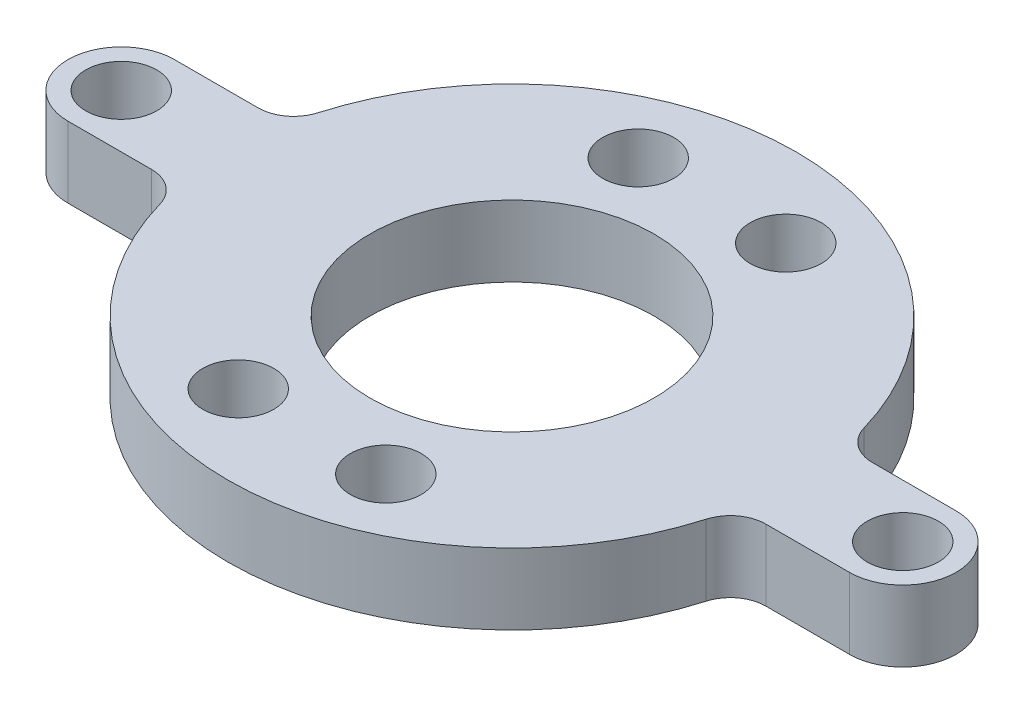
ISO-10303-21;
HEADER;
FILE_DESCRIPTION(('STEP AP214'),'2;1');
FILE_NAME('part.step','',(''),(''),'','','');
FILE_SCHEMA(('AUTOMOTIVE_DESIGN { 1 0 10303 214 1 1 1 1 }'));
ENDSEC;
DATA;
#1=APPLICATION_CONTEXT('core data for automotive mechanical design processes');
#2=APPLICATION_PROTOCOL_DEFINITION('international standard','automotive_design',2000,#1);
#3=PRODUCT_CONTEXT('',#1,'mechanical');
#4=PRODUCT('Part','Part','',(#3));
#5=PRODUCT_RELATED_PRODUCT_CATEGORY('part','',(#4));
#6=PRODUCT_DEFINITION_FORMATION('','',#4);
#7=PRODUCT_DEFINITION_CONTEXT('part definition',#1,'design');
#8=PRODUCT_DEFINITION('design','',#6,#7);
#9=PRODUCT_DEFINITION_SHAPE('','',#8);
#10=(LENGTH_UNIT() NAMED_UNIT(*) SI_UNIT(.MILLI.,.METRE.));
#11=(NAMED_UNIT(*) PLANE_ANGLE_UNIT() SI_UNIT($,.RADIAN.));
#12=(NAMED_UNIT(*) SI_UNIT($,.STERADIAN.) SOLID_ANGLE_UNIT());
#13=UNCERTAINTY_MEASURE_WITH_UNIT(LENGTH_MEASURE(1.E-05),#10,'distance_accuracy_value','');
#14=(GEOMETRIC_REPRESENTATION_CONTEXT(3) GLOBAL_UNCERTAINTY_ASSIGNED_CONTEXT((#13)) GLOBAL_UNIT_ASSIGNED_CONTEXT((#10,
#11,#12)) REPRESENTATION_CONTEXT('',''));
#15=CARTESIAN_POINT('',(0.,0.,0.));
#16=DIRECTION('',(0.,0.,1.));
#17=DIRECTION('',(1.,0.,0.));
#18=AXIS2_PLACEMENT_3D('',#15,#16,#17);
#19=CARTESIAN_POINT('',(43.2290411644765,10.,12.4999999999997));
#20=DIRECTION('',(0.,-1.,0.));
#21=DIRECTION('',(0.,0.,-1.));
#22=AXIS2_PLACEMENT_3D('',#19,#20,#21);
#23=PLANE('',#22);
#24=CARTESIAN_POINT('',(43.2290411644765,10.,12.4999999999997));
#25=DIRECTION('',(0.,-1.,0.));
#26=DIRECTION('',(0.,0.,-1.));
#27=AXIS2_PLACEMENT_3D('',#24,#25,#26);
#28=CIRCLE('',#27,4.99999999999998);
#29=CARTESIAN_POINT('',(38.4258143684236,10.,11.1111111111109));
#30=VERTEX_POINT('',#29);
#31=CARTESIAN_POINT('',(43.2290411644765,10.,7.49999999999967));
#32=VERTEX_POINT('',#31);
#33=EDGE_CURVE('E200',#30,#32,#28,.T.);
#34=ORIENTED_EDGE('',*,*,#33,.T.);
#35=DIRECTION('',(1.,0.,0.));
#36=VECTOR('',#35,1.);
#37=CARTESIAN_POINT('',(55.0000000000001,10.,7.49999999999967));
#38=LINE('',#37,#36);
#39=CARTESIAN_POINT('',(55.0000000000001,10.,7.5));
#40=VERTEX_POINT('',#39);
#41=EDGE_CURVE('E112',#32,#40,#38,.T.);
#42=ORIENTED_EDGE('',*,*,#41,.T.);
#43=CARTESIAN_POINT('',(55.,10.,0.));
#44=DIRECTION('',(0.,1.,0.));
#45=DIRECTION('',(0.,0.,1.));
#46=AXIS2_PLACEMENT_3D('',#43,#44,#45);
#47=CIRCLE('',#46,7.5);
#48=CARTESIAN_POINT('',(54.9999999999999,10.,-7.50000000000033));
#49=VERTEX_POINT('',#48);
#50=EDGE_CURVE('E237',#40,#49,#47,.T.);
#51=ORIENTED_EDGE('',*,*,#50,.T.);
#52=DIRECTION('',(-1.,0.,0.));
#53=VECTOR('',#52,1.);
#54=CARTESIAN_POINT('',(54.9999999999999,10.,-7.50000000000033));
#55=LINE('',#54,#53);
#56=CARTESIAN_POINT('',(43.2290411644764,10.,-7.50000000000032));
#57=VERTEX_POINT('',#56);
#58=EDGE_CURVE('E257',#49,#57,#55,.T.);
#59=ORIENTED_EDGE('',*,*,#58,.T.);
#60=CARTESIAN_POINT('',(43.2290411644764,10.,-12.5000000000003));
#61=DIRECTION('',(0.,-1.,0.));
#62=DIRECTION('',(0.,0.,1.));
#63=AXIS2_PLACEMENT_3D('',#60,#61,#62);
#64=CIRCLE('',#63,5.00000000000001);
#65=CARTESIAN_POINT('',(38.4258143684234,10.,-11.1111111111113));
#66=VERTEX_POINT('',#65);
#67=EDGE_CURVE('E253',#57,#66,#64,.T.);
#68=ORIENTED_EDGE('',*,*,#67,.T.);
#69=CARTESIAN_POINT('',(0.,10.,0.));
#70=DIRECTION('',(0.,1.,0.));
#71=DIRECTION('',(0.,0.,1.));
#72=AXIS2_PLACEMENT_3D('',#69,#70,#71);
#73=CIRCLE('',#72,40.);
#74=CARTESIAN_POINT('',(-38.4258143684235,10.,-11.1111111111111));
#75=VERTEX_POINT('',#74);
#76=EDGE_CURVE('E256',#66,#75,#73,.T.);
#77=ORIENTED_EDGE('',*,*,#76,.T.);
#78=CARTESIAN_POINT('',(-43.2290411644765,10.,-12.5));
#79=DIRECTION('',(0.,-1.,0.));
#80=DIRECTION('',(0.,0.,-1.));
#81=AXIS2_PLACEMENT_3D('',#78,#79,#80);
#82=CIRCLE('',#81,5.);
#83=CARTESIAN_POINT('',(-43.2290411644765,10.,-7.5));
#84=VERTEX_POINT('',#83);
#85=EDGE_CURVE('E261',#75,#84,#82,.T.);
#86=ORIENTED_EDGE('',*,*,#85,.T.);
#87=DIRECTION('',(-1.,0.,0.));
#88=VECTOR('',#87,1.);
#89=CARTESIAN_POINT('',(-55.,10.,-7.5));
#90=LINE('',#89,#88);
#91=CARTESIAN_POINT('',(-55.,10.,-7.49999999999967));
#92=VERTEX_POINT('',#91);
#93=EDGE_CURVE('E268',#84,#92,#90,.T.);
#94=ORIENTED_EDGE('',*,*,#93,.T.);
#95=CARTESIAN_POINT('',(-55.,10.,3.33066907387547E-13));
#96=DIRECTION('',(0.,1.,0.));
#97=DIRECTION('',(0.,0.,-1.));
#98=AXIS2_PLACEMENT_3D('',#95,#96,#97);
#99=CIRCLE('',#98,7.5);
#100=CARTESIAN_POINT('',(-55.,10.,7.5));
#101=VERTEX_POINT('',#100);
#102=EDGE_CURVE('E143',#92,#101,#99,.T.);
#103=ORIENTED_EDGE('',*,*,#102,.T.);
#104=DIRECTION('',(1.,0.,0.));
#105=VECTOR('',#104,1.);
#106=CARTESIAN_POINT('',(-55.,10.,7.5));
#107=LINE('',#106,#105);
#108=CARTESIAN_POINT('',(-43.2290411644765,10.,7.5));
#109=VERTEX_POINT('',#108);
#110=EDGE_CURVE('E137',#101,#109,#107,.T.);
#111=ORIENTED_EDGE('',*,*,#110,.T.);
#112=CARTESIAN_POINT('',(-43.2290411644765,10.,12.5));
#113=DIRECTION('',(0.,-1.,0.));
#114=DIRECTION('',(0.,0.,1.));
#115=AXIS2_PLACEMENT_3D('',#112,#113,#114);
#116=CIRCLE('',#115,5.);
#117=CARTESIAN_POINT('',(-38.4258143684235,10.,11.1111111111111));
#118=VERTEX_POINT('',#117);
#119=EDGE_CURVE('E141',#109,#118,#116,.T.);
#120=ORIENTED_EDGE('',*,*,#119,.T.);
#121=CARTESIAN_POINT('',(0.,10.,0.));
#122=DIRECTION('',(0.,1.,0.));
#123=DIRECTION('',(0.,0.,1.));
#124=AXIS2_PLACEMENT_3D('',#121,#122,#123);
#125=CIRCLE('',#124,40.);
#126=EDGE_CURVE('E57',#118,#30,#125,.T.);
#127=ORIENTED_EDGE('',*,*,#126,.T.);
#128=EDGE_LOOP('',(#34,#42,#51,#59,#68,#77,#86,#94,#103,#111,#120,#127));
#129=FACE_BOUND('',#128,.T.);
#130=CARTESIAN_POINT('',(0.,10.,0.));
#131=DIRECTION('',(0.,1.,0.));
#132=DIRECTION('',(0.,0.,1.));
#133=AXIS2_PLACEMENT_3D('',#130,#131,#132);
#134=CIRCLE('',#133,20.);
#135=CARTESIAN_POINT('',(0.,10.,20.));
#136=VERTEX_POINT('',#135);
#137=EDGE_CURVE('E170',#136,#136,#134,.T.);
#138=ORIENTED_EDGE('',*,*,#137,.F.);
#139=EDGE_LOOP('',(#138));
#140=FACE_BOUND('',#139,.T.);
#141=CARTESIAN_POINT('',(55.,10.,0.));
#142=DIRECTION('',(0.,1.,0.));
#143=DIRECTION('',(0.,0.,1.));
#144=AXIS2_PLACEMENT_3D('',#141,#142,#143);
#145=CIRCLE('',#144,5.);
#146=CARTESIAN_POINT('',(55.,10.,5.));
#147=VERTEX_POINT('',#146);
#148=EDGE_CURVE('E374',#147,#147,#145,.T.);
#149=ORIENTED_EDGE('',*,*,#148,.F.);
#150=EDGE_LOOP('',(#149));
#151=FACE_BOUND('',#150,.T.);
#152=CARTESIAN_POINT('',(-55.,10.,3.33066907387547E-13));
#153=DIRECTION('',(0.,1.,0.));
#154=DIRECTION('',(0.,0.,-1.));
#155=AXIS2_PLACEMENT_3D('',#152,#153,#154);
#156=CIRCLE('',#155,4.99999999999999);
#157=CARTESIAN_POINT('',(-55.,10.,-4.99999999999965));
#158=VERTEX_POINT('',#157);
#159=EDGE_CURVE('E366',#158,#158,#156,.T.);
#160=ORIENTED_EDGE('',*,*,#159,.F.);
#161=EDGE_LOOP('',(#160));
#162=FACE_BOUND('',#161,.T.);
#163=CARTESIAN_POINT('',(10.3835117123248,10.,-28.1457400776745));
#164=DIRECTION('',(0.,1.,0.));
#165=DIRECTION('',(0.,0.,1.));
#166=AXIS2_PLACEMENT_3D('',#163,#164,#165);
#167=CIRCLE('',#166,5.);
#168=CARTESIAN_POINT('',(10.3835117123248,10.,-23.1457400776745));
#169=VERTEX_POINT('',#168);
#170=EDGE_CURVE('E358',#169,#169,#167,.T.);
#171=ORIENTED_EDGE('',*,*,#170,.F.);
#172=EDGE_LOOP('',(#171));
#173=FACE_BOUND('',#172,.T.);
#174=CARTESIAN_POINT('',(-10.3835117123248,10.,-28.1457400776745));
#175=DIRECTION('',(0.,1.,0.));
#176=DIRECTION('',(0.,0.,-1.));
#177=AXIS2_PLACEMENT_3D('',#174,#175,#176);
#178=CIRCLE('',#177,5.);
#179=CARTESIAN_POINT('',(-10.3835117123248,10.,-33.1457400776745));
#180=VERTEX_POINT('',#179);
#181=EDGE_CURVE('E350',#180,#180,#178,.T.);
#182=ORIENTED_EDGE('',*,*,#181,.F.);
#183=EDGE_LOOP('',(#182));
#184=FACE_BOUND('',#183,.T.);
#185=CARTESIAN_POINT('',(10.383511712325,10.,28.1457400776744));
#186=DIRECTION('',(0.,1.,0.));
#187=DIRECTION('',(0.,0.,-1.));
#188=AXIS2_PLACEMENT_3D('',#185,#186,#187);
#189=CIRCLE('',#188,4.99999999999984);
#190=CARTESIAN_POINT('',(10.383511712325,10.,23.1457400776746));
#191=VERTEX_POINT('',#190);
#192=EDGE_CURVE('E342',#191,#191,#189,.T.);
#193=ORIENTED_EDGE('',*,*,#192,.F.);
#194=EDGE_LOOP('',(#193));
#195=FACE_BOUND('',#194,.T.);
#196=CARTESIAN_POINT('',(-10.3835117123248,10.,28.1457400776745));
#197=DIRECTION('',(0.,1.,0.));
#198=DIRECTION('',(0.,0.,1.));
#199=AXIS2_PLACEMENT_3D('',#196,#197,#198);
#200=CIRCLE('',#199,5.);
#201=CARTESIAN_POINT('',(-10.3835117123248,10.,33.1457400776745));
#202=VERTEX_POINT('',#201);
#203=EDGE_CURVE('E331',#202,#202,#200,.T.);
#204=ORIENTED_EDGE('',*,*,#203,.F.);
#205=EDGE_LOOP('',(#204));
#206=FACE_BOUND('',#205,.T.);
#207=ADVANCED_FACE('F39',(#129,#140,#151,#162,#173,#184,#195,#206),#23,.F.);
#208=CARTESIAN_POINT('',(43.2290411644765,0.,12.4999999999997));
#209=DIRECTION('',(0.,-1.,0.));
#210=DIRECTION('',(0.,0.,-1.));
#211=AXIS2_PLACEMENT_3D('',#208,#209,#210);
#212=PLANE('',#211);
#213=CARTESIAN_POINT('',(10.383511712325,0.,28.1457400776744));
#214=DIRECTION('',(0.,1.,0.));
#215=DIRECTION('',(0.,0.,-1.));
#216=AXIS2_PLACEMENT_3D('',#213,#214,#215);
#217=CIRCLE('',#216,4.99999999999984);
#218=CARTESIAN_POINT('',(10.383511712325,0.,23.1457400776746));
#219=VERTEX_POINT('',#218);
#220=EDGE_CURVE('E339',#219,#219,#217,.T.);
#221=ORIENTED_EDGE('',*,*,#220,.T.);
#222=EDGE_LOOP('',(#221));
#223=FACE_BOUND('',#222,.T.);
#224=CARTESIAN_POINT('',(10.3835117123248,0.,-28.1457400776745));
#225=DIRECTION('',(0.,1.,0.));
#226=DIRECTION('',(0.,0.,1.));
#227=AXIS2_PLACEMENT_3D('',#224,#225,#226);
#228=CIRCLE('',#227,5.);
#229=CARTESIAN_POINT('',(10.3835117123248,0.,-23.1457400776745));
#230=VERTEX_POINT('',#229);
#231=EDGE_CURVE('E354',#230,#230,#228,.T.);
#232=ORIENTED_EDGE('',*,*,#231,.T.);
#233=EDGE_LOOP('',(#232));
#234=FACE_BOUND('',#233,.T.);
#235=CARTESIAN_POINT('',(55.,0.,0.));
#236=DIRECTION('',(0.,1.,0.));
#237=DIRECTION('',(0.,0.,1.));
#238=AXIS2_PLACEMENT_3D('',#235,#236,#237);
#239=CIRCLE('',#238,5.);
#240=CARTESIAN_POINT('',(55.,0.,5.));
#241=VERTEX_POINT('',#240);
#242=EDGE_CURVE('E370',#241,#241,#239,.T.);
#243=ORIENTED_EDGE('',*,*,#242,.T.);
#244=EDGE_LOOP('',(#243));
#245=FACE_BOUND('',#244,.T.);
#246=CARTESIAN_POINT('',(43.2290411644765,0.,12.4999999999997));
#247=DIRECTION('',(0.,-1.,0.));
#248=DIRECTION('',(0.,0.,-1.));
#249=AXIS2_PLACEMENT_3D('',#246,#247,#248);
#250=CIRCLE('',#249,4.99999999999998);
#251=CARTESIAN_POINT('',(38.4258143684236,0.,11.1111111111109));
#252=VERTEX_POINT('',#251);
#253=CARTESIAN_POINT('',(43.2290411644765,0.,7.49999999999967));
#254=VERTEX_POINT('',#253);
#255=EDGE_CURVE('E165',#252,#254,#250,.T.);
#256=ORIENTED_EDGE('',*,*,#255,.F.);
#257=CARTESIAN_POINT('',(0.,0.,0.));
#258=DIRECTION('',(0.,1.,0.));
#259=DIRECTION('',(0.,0.,1.));
#260=AXIS2_PLACEMENT_3D('',#257,#258,#259);
#261=CIRCLE('',#260,40.);
#262=CARTESIAN_POINT('',(-38.4258143684235,0.,11.1111111111111));
#263=VERTEX_POINT('',#262);
#264=EDGE_CURVE('E104',#263,#252,#261,.T.);
#265=ORIENTED_EDGE('',*,*,#264,.F.);
#266=CARTESIAN_POINT('',(-43.2290411644765,0.,12.5));
#267=DIRECTION('',(0.,-1.,0.));
#268=DIRECTION('',(0.,0.,1.));
#269=AXIS2_PLACEMENT_3D('',#266,#267,#268);
#270=CIRCLE('',#269,5.);
#271=CARTESIAN_POINT('',(-43.2290411644765,0.,7.5));
#272=VERTEX_POINT('',#271);
#273=EDGE_CURVE('E98',#272,#263,#270,.T.);
#274=ORIENTED_EDGE('',*,*,#273,.F.);
#275=DIRECTION('',(1.,0.,0.));
#276=VECTOR('',#275,1.);
#277=CARTESIAN_POINT('',(-55.,0.,7.5));
#278=LINE('',#277,#276);
#279=CARTESIAN_POINT('',(-55.,0.,7.5));
#280=VERTEX_POINT('',#279);
#281=EDGE_CURVE('E152',#280,#272,#278,.T.);
#282=ORIENTED_EDGE('',*,*,#281,.F.);
#283=CARTESIAN_POINT('',(-55.,0.,3.33066907387547E-13));
#284=DIRECTION('',(0.,1.,0.));
#285=DIRECTION('',(0.,0.,-1.));
#286=AXIS2_PLACEMENT_3D('',#283,#284,#285);
#287=CIRCLE('',#286,7.5);
#288=CARTESIAN_POINT('',(-55.,0.,-7.49999999999967));
#289=VERTEX_POINT('',#288);
#290=EDGE_CURVE('E191',#289,#280,#287,.T.);
#291=ORIENTED_EDGE('',*,*,#290,.F.);
#292=DIRECTION('',(-1.,0.,0.));
#293=VECTOR('',#292,1.);
#294=CARTESIAN_POINT('',(-55.,0.,-7.5));
#295=LINE('',#294,#293);
#296=CARTESIAN_POINT('',(-43.2290411644765,0.,-7.5));
#297=VERTEX_POINT('',#296);
#298=EDGE_CURVE('E188',#297,#289,#295,.T.);
#299=ORIENTED_EDGE('',*,*,#298,.F.);
#300=CARTESIAN_POINT('',(-43.2290411644765,0.,-12.5));
#301=DIRECTION('',(0.,-1.,0.));
#302=DIRECTION('',(0.,0.,-1.));
#303=AXIS2_PLACEMENT_3D('',#300,#301,#302);
#304=CIRCLE('',#303,5.);
#305=CARTESIAN_POINT('',(-38.4258143684235,0.,-11.1111111111111));
#306=VERTEX_POINT('',#305);
#307=EDGE_CURVE('E185',#306,#297,#304,.T.);
#308=ORIENTED_EDGE('',*,*,#307,.F.);
#309=CARTESIAN_POINT('',(0.,0.,0.));
#310=DIRECTION('',(0.,1.,0.));
#311=DIRECTION('',(0.,0.,1.));
#312=AXIS2_PLACEMENT_3D('',#309,#310,#311);
#313=CIRCLE('',#312,40.);
#314=CARTESIAN_POINT('',(38.4258143684234,0.,-11.1111111111113));
#315=VERTEX_POINT('',#314);
#316=EDGE_CURVE('E182',#315,#306,#313,.T.);
#317=ORIENTED_EDGE('',*,*,#316,.F.);
#318=CARTESIAN_POINT('',(43.2290411644764,0.,-12.5000000000003));
#319=DIRECTION('',(0.,-1.,0.));
#320=DIRECTION('',(0.,0.,1.));
#321=AXIS2_PLACEMENT_3D('',#318,#319,#320);
#322=CIRCLE('',#321,5.00000000000001);
#323=CARTESIAN_POINT('',(43.2290411644764,0.,-7.50000000000032));
#324=VERTEX_POINT('',#323);
#325=EDGE_CURVE('E179',#324,#315,#322,.T.);
#326=ORIENTED_EDGE('',*,*,#325,.F.);
#327=DIRECTION('',(-1.,0.,0.));
#328=VECTOR('',#327,1.);
#329=CARTESIAN_POINT('',(54.9999999999999,0.,-7.50000000000033));
#330=LINE('',#329,#328);
#331=CARTESIAN_POINT('',(54.9999999999999,0.,-7.50000000000033));
#332=VERTEX_POINT('',#331);
#333=EDGE_CURVE('E176',#332,#324,#330,.T.);
#334=ORIENTED_EDGE('',*,*,#333,.F.);
#335=CARTESIAN_POINT('',(55.,0.,0.));
#336=DIRECTION('',(0.,1.,0.));
#337=DIRECTION('',(0.,0.,1.));
#338=AXIS2_PLACEMENT_3D('',#335,#336,#337);
#339=CIRCLE('',#338,7.5);
#340=CARTESIAN_POINT('',(55.0000000000001,0.,7.5));
#341=VERTEX_POINT('',#340);
#342=EDGE_CURVE('E173',#341,#332,#339,.T.);
#343=ORIENTED_EDGE('',*,*,#342,.F.);
#344=DIRECTION('',(1.,0.,0.));
#345=VECTOR('',#344,1.);
#346=CARTESIAN_POINT('',(55.0000000000001,0.,7.49999999999967));
#347=LINE('',#346,#345);
#348=EDGE_CURVE('E169',#254,#341,#347,.T.);
#349=ORIENTED_EDGE('',*,*,#348,.F.);
#350=EDGE_LOOP('',(#256,#265,#274,#282,#291,#299,#308,#317,#326,#334,#343,#349));
#351=FACE_BOUND('',#350,.T.);
#352=CARTESIAN_POINT('',(0.,0.,0.));
#353=DIRECTION('',(0.,1.,0.));
#354=DIRECTION('',(0.,0.,1.));
#355=AXIS2_PLACEMENT_3D('',#352,#353,#354);
#356=CIRCLE('',#355,20.);
#357=CARTESIAN_POINT('',(0.,0.,20.));
#358=VERTEX_POINT('',#357);
#359=EDGE_CURVE('E378',#358,#358,#356,.T.);
#360=ORIENTED_EDGE('',*,*,#359,.T.);
#361=EDGE_LOOP('',(#360));
#362=FACE_BOUND('',#361,.T.);
#363=CARTESIAN_POINT('',(-55.,0.,3.33066907387547E-13));
#364=DIRECTION('',(0.,1.,0.));
#365=DIRECTION('',(0.,0.,-1.));
#366=AXIS2_PLACEMENT_3D('',#363,#364,#365);
#367=CIRCLE('',#366,4.99999999999999);
#368=CARTESIAN_POINT('',(-55.,0.,-4.99999999999965));
#369=VERTEX_POINT('',#368);
#370=EDGE_CURVE('E362',#369,#369,#367,.T.);
#371=ORIENTED_EDGE('',*,*,#370,.T.);
#372=EDGE_LOOP('',(#371));
#373=FACE_BOUND('',#372,.T.);
#374=CARTESIAN_POINT('',(-10.3835117123248,0.,-28.1457400776745));
#375=DIRECTION('',(0.,1.,0.));
#376=DIRECTION('',(0.,0.,-1.));
#377=AXIS2_PLACEMENT_3D('',#374,#375,#376);
#378=CIRCLE('',#377,5.);
#379=CARTESIAN_POINT('',(-10.3835117123248,0.,-33.1457400776745));
#380=VERTEX_POINT('',#379);
#381=EDGE_CURVE('E346',#380,#380,#378,.T.);
#382=ORIENTED_EDGE('',*,*,#381,.T.);
#383=EDGE_LOOP('',(#382));
#384=FACE_BOUND('',#383,.T.);
#385=CARTESIAN_POINT('',(-10.3835117123248,0.,28.1457400776745));
#386=DIRECTION('',(0.,1.,0.));
#387=DIRECTION('',(0.,0.,1.));
#388=AXIS2_PLACEMENT_3D('',#385,#386,#387);
#389=CIRCLE('',#388,5.);
#390=CARTESIAN_POINT('',(-10.3835117123248,0.,33.1457400776745));
#391=VERTEX_POINT('',#390);
#392=EDGE_CURVE('E334',#391,#391,#389,.T.);
#393=ORIENTED_EDGE('',*,*,#392,.T.);
#394=EDGE_LOOP('',(#393));
#395=FACE_BOUND('',#394,.T.);
#396=ADVANCED_FACE('F241',(#223,#234,#245,#351,#362,#373,#384,#395),#212,.T.);
#397=CARTESIAN_POINT('',(43.2290411644765,10.,12.4999999999997));
#398=DIRECTION('',(0.,-1.,0.));
#399=DIRECTION('',(0.,0.,-1.));
#400=AXIS2_PLACEMENT_3D('',#397,#398,#399);
#401=CYLINDRICAL_SURFACE('',#400,4.99999999999998);
#402=ORIENTED_EDGE('',*,*,#255,.T.);
#403=DIRECTION('',(0.,-1.,0.));
#404=VECTOR('',#403,1.);
#405=CARTESIAN_POINT('',(43.2290411644765,10.,7.49999999999967));
#406=LINE('',#405,#404);
#407=EDGE_CURVE('E11',#32,#254,#406,.T.);
#408=ORIENTED_EDGE('',*,*,#407,.F.);
#409=ORIENTED_EDGE('',*,*,#33,.F.);
#410=DIRECTION('',(0.,-1.,0.));
#411=VECTOR('',#410,1.);
#412=CARTESIAN_POINT('',(38.4258143684236,10.,11.1111111111109));
#413=LINE('',#412,#411);
#414=EDGE_CURVE('E161',#30,#252,#413,.T.);
#415=ORIENTED_EDGE('',*,*,#414,.T.);
#416=EDGE_LOOP('',(#402,#408,#409,#415));
#417=FACE_BOUND('',#416,.T.);
#418=ADVANCED_FACE('F41',(#417),#401,.F.);
#419=CARTESIAN_POINT('',(55.0000000000001,10.,7.49999999999967));
#420=DIRECTION('',(0.,0.,-1.));
#421=DIRECTION('',(-1.,0.,0.));
#422=AXIS2_PLACEMENT_3D('',#419,#420,#421);
#423=PLANE('',#422);
#424=ORIENTED_EDGE('',*,*,#348,.T.);
#425=DIRECTION('',(0.,-1.,0.));
#426=VECTOR('',#425,1.);
#427=CARTESIAN_POINT('',(55.0000000000001,10.,7.5));
#428=LINE('',#427,#426);
#429=EDGE_CURVE('E49',#40,#341,#428,.T.);
#430=ORIENTED_EDGE('',*,*,#429,.F.);
#431=ORIENTED_EDGE('',*,*,#41,.F.);
#432=ORIENTED_EDGE('',*,*,#407,.T.);
#433=EDGE_LOOP('',(#424,#430,#431,#432));
#434=FACE_BOUND('',#433,.T.);
#435=ADVANCED_FACE('F523',(#434),#423,.F.);
#436=CARTESIAN_POINT('',(55.,10.,0.));
#437=DIRECTION('',(0.,-1.,0.));
#438=DIRECTION('',(0.,0.,-1.));
#439=AXIS2_PLACEMENT_3D('',#436,#437,#438);
#440=CYLINDRICAL_SURFACE('',#439,7.5);
#441=ORIENTED_EDGE('',*,*,#342,.T.);
#442=DIRECTION('',(0.,-1.,0.));
#443=VECTOR('',#442,1.);
#444=CARTESIAN_POINT('',(54.9999999999999,10.,-7.50000000000033));
#445=LINE('',#444,#443);
#446=EDGE_CURVE('E227',#49,#332,#445,.T.);
#447=ORIENTED_EDGE('',*,*,#446,.F.);
#448=ORIENTED_EDGE('',*,*,#50,.F.);
#449=ORIENTED_EDGE('',*,*,#429,.T.);
#450=EDGE_LOOP('',(#441,#447,#448,#449));
#451=FACE_BOUND('',#450,.T.);
#452=ADVANCED_FACE('F235',(#451),#440,.T.);
#453=CARTESIAN_POINT('',(54.9999999999999,10.,-7.50000000000033));
#454=DIRECTION('',(0.,0.,1.));
#455=DIRECTION('',(1.,0.,0.));
#456=AXIS2_PLACEMENT_3D('',#453,#454,#455);
#457=PLANE('',#456);
#458=ORIENTED_EDGE('',*,*,#333,.T.);
#459=DIRECTION('',(0.,-1.,0.));
#460=VECTOR('',#459,1.);
#461=CARTESIAN_POINT('',(43.2290411644764,10.,-7.50000000000032));
#462=LINE('',#461,#460);
#463=EDGE_CURVE('E223',#57,#324,#462,.T.);
#464=ORIENTED_EDGE('',*,*,#463,.F.);
#465=ORIENTED_EDGE('',*,*,#58,.F.);
#466=ORIENTED_EDGE('',*,*,#446,.T.);
#467=EDGE_LOOP('',(#458,#464,#465,#466));
#468=FACE_BOUND('',#467,.T.);
#469=ADVANCED_FACE('F247',(#468),#457,.F.);
#470=CARTESIAN_POINT('',(43.2290411644764,10.,-12.5000000000003));
#471=DIRECTION('',(0.,-1.,0.));
#472=DIRECTION('',(0.,0.,-1.));
#473=AXIS2_PLACEMENT_3D('',#470,#471,#472);
#474=CYLINDRICAL_SURFACE('',#473,5.00000000000001);
#475=ORIENTED_EDGE('',*,*,#325,.T.);
#476=DIRECTION('',(0.,-1.,0.));
#477=VECTOR('',#476,1.);
#478=CARTESIAN_POINT('',(38.4258143684234,10.,-11.1111111111113));
#479=LINE('',#478,#477);
#480=EDGE_CURVE('E219',#66,#315,#479,.T.);
#481=ORIENTED_EDGE('',*,*,#480,.F.);
#482=ORIENTED_EDGE('',*,*,#67,.F.);
#483=ORIENTED_EDGE('',*,*,#463,.T.);
#484=EDGE_LOOP('',(#475,#481,#482,#483));
#485=FACE_BOUND('',#484,.T.);
#486=ADVANCED_FACE('F251',(#485),#474,.F.);
#487=CARTESIAN_POINT('',(0.,10.,0.));
#488=DIRECTION('',(0.,-1.,0.));
#489=DIRECTION('',(0.,0.,-1.));
#490=AXIS2_PLACEMENT_3D('',#487,#488,#489);
#491=CYLINDRICAL_SURFACE('',#490,40.);
#492=ORIENTED_EDGE('',*,*,#316,.T.);
#493=DIRECTION('',(0.,-1.,0.));
#494=VECTOR('',#493,1.);
#495=CARTESIAN_POINT('',(-38.4258143684235,10.,-11.1111111111111));
#496=LINE('',#495,#494);
#497=EDGE_CURVE('E215',#75,#306,#496,.T.);
#498=ORIENTED_EDGE('',*,*,#497,.F.);
#499=ORIENTED_EDGE('',*,*,#76,.F.);
#500=ORIENTED_EDGE('',*,*,#480,.T.);
#501=EDGE_LOOP('',(#492,#498,#499,#500));
#502=FACE_BOUND('',#501,.T.);
#503=ADVANCED_FACE('F488',(#502),#491,.T.);
#504=CARTESIAN_POINT('',(-43.2290411644765,10.,-12.5));
#505=DIRECTION('',(0.,-1.,0.));
#506=DIRECTION('',(0.,0.,-1.));
#507=AXIS2_PLACEMENT_3D('',#504,#505,#506);
#508=CYLINDRICAL_SURFACE('',#507,5.);
#509=ORIENTED_EDGE('',*,*,#307,.T.);
#510=DIRECTION('',(0.,-1.,0.));
#511=VECTOR('',#510,1.);
#512=CARTESIAN_POINT('',(-43.2290411644765,10.,-7.5));
#513=LINE('',#512,#511);
#514=EDGE_CURVE('E211',#84,#297,#513,.T.);
#515=ORIENTED_EDGE('',*,*,#514,.F.);
#516=ORIENTED_EDGE('',*,*,#85,.F.);
#517=ORIENTED_EDGE('',*,*,#497,.T.);
#518=EDGE_LOOP('',(#509,#515,#516,#517));
#519=FACE_BOUND('',#518,.T.);
#520=ADVANCED_FACE('F479',(#519),#508,.F.);
#521=CARTESIAN_POINT('',(-55.,10.,-7.5));
#522=DIRECTION('',(0.,0.,1.));
#523=DIRECTION('',(1.,0.,0.));
#524=AXIS2_PLACEMENT_3D('',#521,#522,#523);
#525=PLANE('',#524);
#526=ORIENTED_EDGE('',*,*,#298,.T.);
#527=DIRECTION('',(0.,-1.,0.));
#528=VECTOR('',#527,1.);
#529=CARTESIAN_POINT('',(-55.,10.,-7.49999999999967));
#530=LINE('',#529,#528);
#531=EDGE_CURVE('E207',#92,#289,#530,.T.);
#532=ORIENTED_EDGE('',*,*,#531,.F.);
#533=ORIENTED_EDGE('',*,*,#93,.F.);
#534=ORIENTED_EDGE('',*,*,#514,.T.);
#535=EDGE_LOOP('',(#526,#532,#533,#534));
#536=FACE_BOUND('',#535,.T.);
#537=ADVANCED_FACE('F276',(#536),#525,.F.);
#538=CARTESIAN_POINT('',(-55.,10.,3.33066907387547E-13));
#539=DIRECTION('',(0.,-1.,0.));
#540=DIRECTION('',(0.,0.,-1.));
#541=AXIS2_PLACEMENT_3D('',#538,#539,#540);
#542=CYLINDRICAL_SURFACE('',#541,7.5);
#543=ORIENTED_EDGE('',*,*,#290,.T.);
#544=DIRECTION('',(0.,-1.,0.));
#545=VECTOR('',#544,1.);
#546=CARTESIAN_POINT('',(-55.,10.,7.5));
#547=LINE('',#546,#545);
#548=EDGE_CURVE('E154',#101,#280,#547,.T.);
#549=ORIENTED_EDGE('',*,*,#548,.F.);
#550=ORIENTED_EDGE('',*,*,#102,.F.);
#551=ORIENTED_EDGE('',*,*,#531,.T.);
#552=EDGE_LOOP('',(#543,#549,#550,#551));
#553=FACE_BOUND('',#552,.T.);
#554=ADVANCED_FACE('F280',(#553),#542,.T.);
#555=CARTESIAN_POINT('',(-55.,10.,7.5));
#556=DIRECTION('',(0.,0.,-1.));
#557=DIRECTION('',(-1.,0.,0.));
#558=AXIS2_PLACEMENT_3D('',#555,#556,#557);
#559=PLANE('',#558);
#560=ORIENTED_EDGE('',*,*,#281,.T.);
#561=DIRECTION('',(0.,-1.,0.));
#562=VECTOR('',#561,1.);
#563=CARTESIAN_POINT('',(-43.2290411644765,10.,7.5));
#564=LINE('',#563,#562);
#565=EDGE_CURVE('E149',#109,#272,#564,.T.);
#566=ORIENTED_EDGE('',*,*,#565,.F.);
#567=ORIENTED_EDGE('',*,*,#110,.F.);
#568=ORIENTED_EDGE('',*,*,#548,.T.);
#569=EDGE_LOOP('',(#560,#566,#567,#568));
#570=FACE_BOUND('',#569,.T.);
#571=ADVANCED_FACE('F150',(#570),#559,.F.);
#572=CARTESIAN_POINT('',(-43.2290411644765,10.,12.5));
#573=DIRECTION('',(0.,-1.,0.));
#574=DIRECTION('',(0.,0.,-1.));
#575=AXIS2_PLACEMENT_3D('',#572,#573,#574);
#576=CYLINDRICAL_SURFACE('',#575,5.);
#577=ORIENTED_EDGE('',*,*,#273,.T.);
#578=DIRECTION('',(0.,-1.,0.));
#579=VECTOR('',#578,1.);
#580=CARTESIAN_POINT('',(-38.4258143684235,10.,11.1111111111111));
#581=LINE('',#580,#579);
#582=EDGE_CURVE('E155',#118,#263,#581,.T.);
#583=ORIENTED_EDGE('',*,*,#582,.F.);
#584=ORIENTED_EDGE('',*,*,#119,.F.);
#585=ORIENTED_EDGE('',*,*,#565,.T.);
#586=EDGE_LOOP('',(#577,#583,#584,#585));
#587=FACE_BOUND('',#586,.T.);
#588=ADVANCED_FACE('F157',(#587),#576,.F.);
#589=CARTESIAN_POINT('',(0.,10.,0.));
#590=DIRECTION('',(0.,-1.,0.));
#591=DIRECTION('',(0.,0.,-1.));
#592=AXIS2_PLACEMENT_3D('',#589,#590,#591);
#593=CYLINDRICAL_SURFACE('',#592,40.);
#594=ORIENTED_EDGE('',*,*,#264,.T.);
#595=ORIENTED_EDGE('',*,*,#414,.F.);
#596=ORIENTED_EDGE('',*,*,#126,.F.);
#597=ORIENTED_EDGE('',*,*,#582,.T.);
#598=EDGE_LOOP('',(#594,#595,#596,#597));
#599=FACE_BOUND('',#598,.T.);
#600=ADVANCED_FACE('F284',(#599),#593,.T.);
#601=CARTESIAN_POINT('',(0.,10.,0.));
#602=DIRECTION('',(0.,-1.,0.));
#603=DIRECTION('',(0.,0.,-1.));
#604=AXIS2_PLACEMENT_3D('',#601,#602,#603);
#605=CYLINDRICAL_SURFACE('',#604,20.);
#606=ORIENTED_EDGE('',*,*,#137,.T.);
#607=EDGE_LOOP('',(#606));
#608=FACE_BOUND('',#607,.T.);
#609=ORIENTED_EDGE('',*,*,#359,.F.);
#610=EDGE_LOOP('',(#609));
#611=FACE_BOUND('',#610,.T.);
#612=ADVANCED_FACE('F286',(#608,#611),#605,.F.);
#613=CARTESIAN_POINT('',(55.,10.,0.));
#614=DIRECTION('',(0.,-1.,0.));
#615=DIRECTION('',(0.,0.,-1.));
#616=AXIS2_PLACEMENT_3D('',#613,#614,#615);
#617=CYLINDRICAL_SURFACE('',#616,5.);
#618=ORIENTED_EDGE('',*,*,#148,.T.);
#619=EDGE_LOOP('',(#618));
#620=FACE_BOUND('',#619,.T.);
#621=ORIENTED_EDGE('',*,*,#242,.F.);
#622=EDGE_LOOP('',(#621));
#623=FACE_BOUND('',#622,.T.);
#624=ADVANCED_FACE('F292',(#620,#623),#617,.F.);
#625=CARTESIAN_POINT('',(-55.,10.,3.33066907387547E-13));
#626=DIRECTION('',(0.,-1.,0.));
#627=DIRECTION('',(0.,0.,-1.));
#628=AXIS2_PLACEMENT_3D('',#625,#626,#627);
#629=CYLINDRICAL_SURFACE('',#628,4.99999999999999);
#630=ORIENTED_EDGE('',*,*,#159,.T.);
#631=EDGE_LOOP('',(#630));
#632=FACE_BOUND('',#631,.T.);
#633=ORIENTED_EDGE('',*,*,#370,.F.);
#634=EDGE_LOOP('',(#633));
#635=FACE_BOUND('',#634,.T.);
#636=ADVANCED_FACE('F306',(#632,#635),#629,.F.);
#637=CARTESIAN_POINT('',(10.3835117123248,10.,-28.1457400776745));
#638=DIRECTION('',(0.,-1.,0.));
#639=DIRECTION('',(0.,0.,-1.));
#640=AXIS2_PLACEMENT_3D('',#637,#638,#639);
#641=CYLINDRICAL_SURFACE('',#640,5.);
#642=ORIENTED_EDGE('',*,*,#170,.T.);
#643=EDGE_LOOP('',(#642));
#644=FACE_BOUND('',#643,.T.);
#645=ORIENTED_EDGE('',*,*,#231,.F.);
#646=EDGE_LOOP('',(#645));
#647=FACE_BOUND('',#646,.T.);
#648=ADVANCED_FACE('F310',(#644,#647),#641,.F.);
#649=CARTESIAN_POINT('',(-10.3835117123248,10.,-28.1457400776745));
#650=DIRECTION('',(0.,-1.,0.));
#651=DIRECTION('',(0.,0.,-1.));
#652=AXIS2_PLACEMENT_3D('',#649,#650,#651);
#653=CYLINDRICAL_SURFACE('',#652,5.);
#654=ORIENTED_EDGE('',*,*,#181,.T.);
#655=EDGE_LOOP('',(#654));
#656=FACE_BOUND('',#655,.T.);
#657=ORIENTED_EDGE('',*,*,#381,.F.);
#658=EDGE_LOOP('',(#657));
#659=FACE_BOUND('',#658,.T.);
#660=ADVANCED_FACE('F314',(#656,#659),#653,.F.);
#661=CARTESIAN_POINT('',(10.383511712325,10.,28.1457400776744));
#662=DIRECTION('',(0.,-1.,0.));
#663=DIRECTION('',(0.,0.,-1.));
#664=AXIS2_PLACEMENT_3D('',#661,#662,#663);
#665=CYLINDRICAL_SURFACE('',#664,4.99999999999984);
#666=ORIENTED_EDGE('',*,*,#192,.T.);
#667=EDGE_LOOP('',(#666));
#668=FACE_BOUND('',#667,.T.);
#669=ORIENTED_EDGE('',*,*,#220,.F.);
#670=EDGE_LOOP('',(#669));
#671=FACE_BOUND('',#670,.T.);
#672=ADVANCED_FACE('F318',(#668,#671),#665,.F.);
#673=CARTESIAN_POINT('',(-10.3835117123248,10.,28.1457400776745));
#674=DIRECTION('',(0.,-1.,0.));
#675=DIRECTION('',(0.,0.,-1.));
#676=AXIS2_PLACEMENT_3D('',#673,#674,#675);
#677=CYLINDRICAL_SURFACE('',#676,5.);
#678=ORIENTED_EDGE('',*,*,#203,.T.);
#679=EDGE_LOOP('',(#678));
#680=FACE_BOUND('',#679,.T.);
#681=ORIENTED_EDGE('',*,*,#392,.F.);
#682=EDGE_LOOP('',(#681));
#683=FACE_BOUND('',#682,.T.);
#684=ADVANCED_FACE('F322',(#680,#683),#677,.F.);
#685=CLOSED_SHELL('',(#207,#396,#418,#435,#452,#469,#486,#503,#520,#537,#554,#571,#588,#600,
#612,#624,#636,#648,#660,#672,#684));
#686=MANIFOLD_SOLID_BREP('B2',#685);
#687=ADVANCED_BREP_SHAPE_REPRESENTATION('',(#18,#686),#14);
#688=SHAPE_DEFINITION_REPRESENTATION(#9,#687);
ENDSEC;
END-ISO-10303-21;
